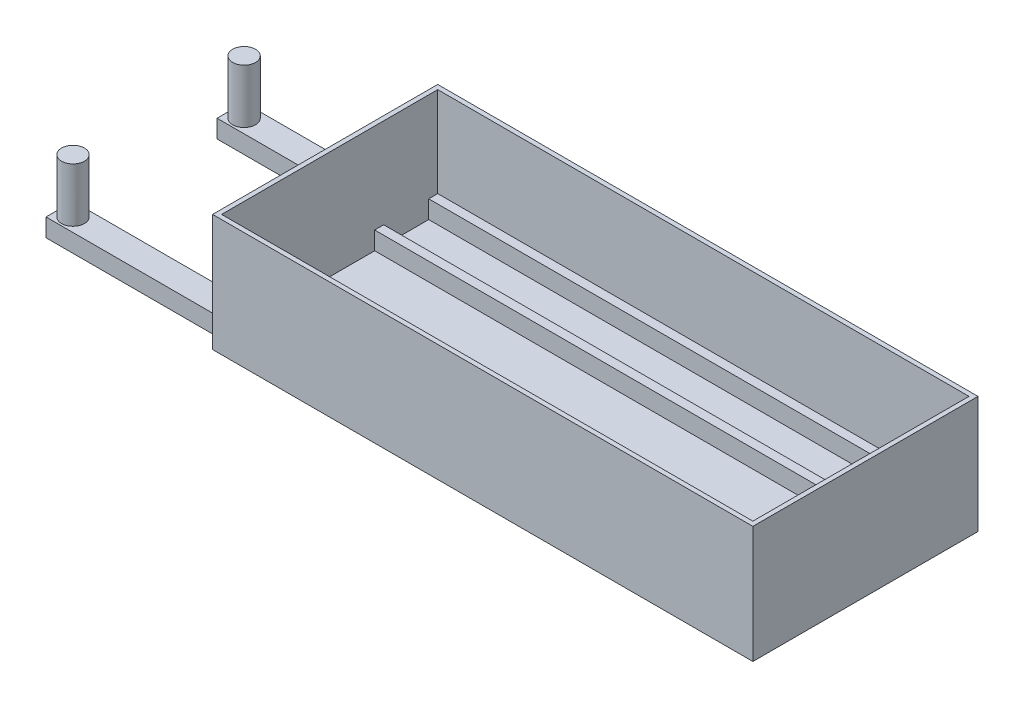
ISO-10303-21;
HEADER;
FILE_DESCRIPTION(('STEP AP214'),'2;1');
FILE_NAME('part.step','',(''),(''),'','','');
FILE_SCHEMA(('AUTOMOTIVE_DESIGN { 1 0 10303 214 1 1 1 1 }'));
ENDSEC;
DATA;
#1=APPLICATION_CONTEXT('core data for automotive mechanical design processes');
#2=APPLICATION_PROTOCOL_DEFINITION('international standard','automotive_design',2000,#1);
#3=PRODUCT_CONTEXT('',#1,'mechanical');
#4=PRODUCT('Part','Part','',(#3));
#5=PRODUCT_RELATED_PRODUCT_CATEGORY('part','',(#4));
#6=PRODUCT_DEFINITION_FORMATION('','',#4);
#7=PRODUCT_DEFINITION_CONTEXT('part definition',#1,'design');
#8=PRODUCT_DEFINITION('design','',#6,#7);
#9=PRODUCT_DEFINITION_SHAPE('','',#8);
#10=(LENGTH_UNIT() NAMED_UNIT(*) SI_UNIT(.MILLI.,.METRE.));
#11=(NAMED_UNIT(*) PLANE_ANGLE_UNIT() SI_UNIT($,.RADIAN.));
#12=(NAMED_UNIT(*) SI_UNIT($,.STERADIAN.) SOLID_ANGLE_UNIT());
#13=UNCERTAINTY_MEASURE_WITH_UNIT(LENGTH_MEASURE(1.E-05),#10,'distance_accuracy_value','');
#14=(GEOMETRIC_REPRESENTATION_CONTEXT(3) GLOBAL_UNCERTAINTY_ASSIGNED_CONTEXT((#13)) GLOBAL_UNIT_ASSIGNED_CONTEXT((#10,
#11,#12)) REPRESENTATION_CONTEXT('',''));
#15=CARTESIAN_POINT('',(0.,0.,0.));
#16=DIRECTION('',(0.,0.,1.));
#17=DIRECTION('',(1.,0.,0.));
#18=AXIS2_PLACEMENT_3D('',#15,#16,#17);
#19=CARTESIAN_POINT('',(-300.,130.,-125.));
#20=DIRECTION('',(1.,0.,0.));
#21=DIRECTION('',(0.,0.,-1.));
#22=AXIS2_PLACEMENT_3D('',#19,#20,#21);
#23=PLANE('',#22);
#24=DIRECTION('',(0.,-1.,0.));
#25=VECTOR('',#24,1.);
#26=CARTESIAN_POINT('',(-300.,0.,80.));
#27=LINE('',#26,#25);
#28=CARTESIAN_POINT('',(-300.,20.0533445197729,80.));
#29=VERTEX_POINT('',#28);
#30=CARTESIAN_POINT('',(-300.,0.,80.));
#31=VERTEX_POINT('',#30);
#32=EDGE_CURVE('E222',#29,#31,#27,.T.);
#33=ORIENTED_EDGE('',*,*,#32,.F.);
#34=DIRECTION('',(0.,0.,-1.));
#35=VECTOR('',#34,1.);
#36=CARTESIAN_POINT('',(-300.,20.0533445197728,0.));
#37=LINE('',#36,#35);
#38=CARTESIAN_POINT('',(-300.,20.0533445197728,110.));
#39=VERTEX_POINT('',#38);
#40=EDGE_CURVE('E227',#39,#29,#37,.T.);
#41=ORIENTED_EDGE('',*,*,#40,.F.);
#42=DIRECTION('',(0.,1.,0.));
#43=VECTOR('',#42,1.);
#44=CARTESIAN_POINT('',(-300.,0.,110.));
#45=LINE('',#44,#43);
#46=CARTESIAN_POINT('',(-300.,0.,110.));
#47=VERTEX_POINT('',#46);
#48=EDGE_CURVE('E410',#47,#39,#45,.T.);
#49=ORIENTED_EDGE('',*,*,#48,.F.);
#50=DIRECTION('',(0.,0.,1.));
#51=VECTOR('',#50,1.);
#52=CARTESIAN_POINT('',(-300.,0.,-125.));
#53=LINE('',#52,#51);
#54=CARTESIAN_POINT('',(-300.,0.,125.));
#55=VERTEX_POINT('',#54);
#56=EDGE_CURVE('E586',#47,#55,#53,.T.);
#57=ORIENTED_EDGE('',*,*,#56,.T.);
#58=DIRECTION('',(0.,-1.,0.));
#59=VECTOR('',#58,1.);
#60=CARTESIAN_POINT('',(-300.,130.,125.));
#61=LINE('',#60,#59);
#62=CARTESIAN_POINT('',(-300.,130.,125.));
#63=VERTEX_POINT('',#62);
#64=EDGE_CURVE('E577',#63,#55,#61,.T.);
#65=ORIENTED_EDGE('',*,*,#64,.F.);
#66=DIRECTION('',(0.,0.,1.));
#67=VECTOR('',#66,1.);
#68=CARTESIAN_POINT('',(-300.,130.,-125.));
#69=LINE('',#68,#67);
#70=CARTESIAN_POINT('',(-300.,130.,-125.));
#71=VERTEX_POINT('',#70);
#72=EDGE_CURVE('E575',#71,#63,#69,.T.);
#73=ORIENTED_EDGE('',*,*,#72,.F.);
#74=DIRECTION('',(0.,-1.,0.));
#75=VECTOR('',#74,1.);
#76=CARTESIAN_POINT('',(-300.,130.,-125.));
#77=LINE('',#76,#75);
#78=CARTESIAN_POINT('',(-300.,0.,-125.));
#79=VERTEX_POINT('',#78);
#80=EDGE_CURVE('E592',#71,#79,#77,.T.);
#81=ORIENTED_EDGE('',*,*,#80,.T.);
#82=CARTESIAN_POINT('',(-300.,0.,-110.));
#83=VERTEX_POINT('',#82);
#84=EDGE_CURVE('E569',#79,#83,#53,.T.);
#85=ORIENTED_EDGE('',*,*,#84,.T.);
#86=DIRECTION('',(0.,1.,0.));
#87=VECTOR('',#86,1.);
#88=CARTESIAN_POINT('',(-300.,0.,-110.));
#89=LINE('',#88,#87);
#90=CARTESIAN_POINT('',(-300.,20.,-110.));
#91=VERTEX_POINT('',#90);
#92=EDGE_CURVE('E426',#83,#91,#89,.T.);
#93=ORIENTED_EDGE('',*,*,#92,.T.);
#94=DIRECTION('',(0.,0.,1.));
#95=VECTOR('',#94,1.);
#96=CARTESIAN_POINT('',(-300.,20.,0.));
#97=LINE('',#96,#95);
#98=CARTESIAN_POINT('',(-300.,20.,-80.));
#99=VERTEX_POINT('',#98);
#100=EDGE_CURVE('E416',#91,#99,#97,.T.);
#101=ORIENTED_EDGE('',*,*,#100,.T.);
#102=DIRECTION('',(0.,-1.,0.));
#103=VECTOR('',#102,1.);
#104=CARTESIAN_POINT('',(-300.,0.,-80.));
#105=LINE('',#104,#103);
#106=CARTESIAN_POINT('',(-300.,0.,-80.));
#107=VERTEX_POINT('',#106);
#108=EDGE_CURVE('E413',#99,#107,#105,.T.);
#109=ORIENTED_EDGE('',*,*,#108,.T.);
#110=EDGE_CURVE('E589',#107,#31,#53,.T.);
#111=ORIENTED_EDGE('',*,*,#110,.T.);
#112=EDGE_LOOP('',(#33,#41,#49,#57,#65,#73,#81,#85,#93,#101,#109,#111));
#113=FACE_BOUND('',#112,.T.);
#114=ADVANCED_FACE('F207',(#113),#23,.F.);
#115=CARTESIAN_POINT('',(295.,10.,-120.));
#116=DIRECTION('',(1.,0.,0.));
#117=DIRECTION('',(0.,0.,-1.));
#118=AXIS2_PLACEMENT_3D('',#115,#116,#117);
#119=PLANE('',#118);
#120=DIRECTION('',(0.,-1.,0.));
#121=VECTOR('',#120,1.);
#122=CARTESIAN_POINT('',(295.,30.,-110.));
#123=LINE('',#122,#121);
#124=CARTESIAN_POINT('',(295.,30.,-110.));
#125=VERTEX_POINT('',#124);
#126=CARTESIAN_POINT('',(295.,10.,-110.));
#127=VERTEX_POINT('',#126);
#128=EDGE_CURVE('E449',#125,#127,#123,.T.);
#129=ORIENTED_EDGE('',*,*,#128,.T.);
#130=DIRECTION('',(0.,0.,-1.));
#131=VECTOR('',#130,1.);
#132=CARTESIAN_POINT('',(295.,10.,-120.));
#133=LINE('',#132,#131);
#134=CARTESIAN_POINT('',(295.,10.,-60.));
#135=VERTEX_POINT('',#134);
#136=EDGE_CURVE('E542',#135,#127,#133,.T.);
#137=ORIENTED_EDGE('',*,*,#136,.F.);
#138=DIRECTION('',(0.,-1.,0.));
#139=VECTOR('',#138,1.);
#140=CARTESIAN_POINT('',(295.,30.,-60.));
#141=LINE('',#140,#139);
#142=CARTESIAN_POINT('',(295.,30.,-60.));
#143=VERTEX_POINT('',#142);
#144=EDGE_CURVE('E470',#143,#135,#141,.T.);
#145=ORIENTED_EDGE('',*,*,#144,.F.);
#146=DIRECTION('',(0.,0.,-1.));
#147=VECTOR('',#146,1.);
#148=CARTESIAN_POINT('',(295.,30.,-50.));
#149=LINE('',#148,#147);
#150=CARTESIAN_POINT('',(295.,30.,-50.));
#151=VERTEX_POINT('',#150);
#152=EDGE_CURVE('E486',#151,#143,#149,.T.);
#153=ORIENTED_EDGE('',*,*,#152,.F.);
#154=DIRECTION('',(0.,-1.,0.));
#155=VECTOR('',#154,1.);
#156=CARTESIAN_POINT('',(295.,30.,-50.));
#157=LINE('',#156,#155);
#158=CARTESIAN_POINT('',(295.,10.,-50.));
#159=VERTEX_POINT('',#158);
#160=EDGE_CURVE('E468',#151,#159,#157,.T.);
#161=ORIENTED_EDGE('',*,*,#160,.T.);
#162=CARTESIAN_POINT('',(295.,10.,50.));
#163=VERTEX_POINT('',#162);
#164=EDGE_CURVE('E541',#163,#159,#133,.T.);
#165=ORIENTED_EDGE('',*,*,#164,.F.);
#166=DIRECTION('',(0.,-1.,0.));
#167=VECTOR('',#166,1.);
#168=CARTESIAN_POINT('',(295.,30.,50.));
#169=LINE('',#168,#167);
#170=CARTESIAN_POINT('',(295.,30.,50.));
#171=VERTEX_POINT('',#170);
#172=EDGE_CURVE('E496',#171,#163,#169,.T.);
#173=ORIENTED_EDGE('',*,*,#172,.F.);
#174=DIRECTION('',(0.,0.,-1.));
#175=VECTOR('',#174,1.);
#176=CARTESIAN_POINT('',(295.,30.,60.));
#177=LINE('',#176,#175);
#178=CARTESIAN_POINT('',(295.,30.,60.));
#179=VERTEX_POINT('',#178);
#180=EDGE_CURVE('E514',#179,#171,#177,.T.);
#181=ORIENTED_EDGE('',*,*,#180,.F.);
#182=DIRECTION('',(0.,-1.,0.));
#183=VECTOR('',#182,1.);
#184=CARTESIAN_POINT('',(295.,30.,60.));
#185=LINE('',#184,#183);
#186=CARTESIAN_POINT('',(295.,10.,60.));
#187=VERTEX_POINT('',#186);
#188=EDGE_CURVE('E483',#179,#187,#185,.T.);
#189=ORIENTED_EDGE('',*,*,#188,.T.);
#190=CARTESIAN_POINT('',(295.,10.,110.));
#191=VERTEX_POINT('',#190);
#192=EDGE_CURVE('E537',#191,#187,#133,.T.);
#193=ORIENTED_EDGE('',*,*,#192,.F.);
#194=DIRECTION('',(0.,-1.,0.));
#195=VECTOR('',#194,1.);
#196=CARTESIAN_POINT('',(295.,30.,110.));
#197=LINE('',#196,#195);
#198=CARTESIAN_POINT('',(295.,30.,110.));
#199=VERTEX_POINT('',#198);
#200=EDGE_CURVE('E529',#199,#191,#197,.T.);
#201=ORIENTED_EDGE('',*,*,#200,.F.);
#202=DIRECTION('',(0.,0.,-1.));
#203=VECTOR('',#202,1.);
#204=CARTESIAN_POINT('',(295.,30.,0.));
#205=LINE('',#204,#203);
#206=CARTESIAN_POINT('',(295.,30.,120.));
#207=VERTEX_POINT('',#206);
#208=EDGE_CURVE('E526',#207,#199,#205,.T.);
#209=ORIENTED_EDGE('',*,*,#208,.F.);
#210=DIRECTION('',(0.,1.,0.));
#211=VECTOR('',#210,1.);
#212=CARTESIAN_POINT('',(295.,10.,120.));
#213=LINE('',#212,#211);
#214=CARTESIAN_POINT('',(295.,130.,120.));
#215=VERTEX_POINT('',#214);
#216=EDGE_CURVE('E558',#207,#215,#213,.T.);
#217=ORIENTED_EDGE('',*,*,#216,.T.);
#218=DIRECTION('',(0.,0.,-1.));
#219=VECTOR('',#218,1.);
#220=CARTESIAN_POINT('',(295.,130.,-120.));
#221=LINE('',#220,#219);
#222=CARTESIAN_POINT('',(295.,130.,-120.));
#223=VERTEX_POINT('',#222);
#224=EDGE_CURVE('E536',#215,#223,#221,.T.);
#225=ORIENTED_EDGE('',*,*,#224,.T.);
#226=DIRECTION('',(0.,1.,0.));
#227=VECTOR('',#226,1.);
#228=CARTESIAN_POINT('',(295.,10.,-120.));
#229=LINE('',#228,#227);
#230=CARTESIAN_POINT('',(295.,30.,-120.));
#231=VERTEX_POINT('',#230);
#232=EDGE_CURVE('E545',#231,#223,#229,.T.);
#233=ORIENTED_EDGE('',*,*,#232,.F.);
#234=DIRECTION('',(0.,0.,1.));
#235=VECTOR('',#234,1.);
#236=CARTESIAN_POINT('',(295.,30.,-120.));
#237=LINE('',#236,#235);
#238=EDGE_CURVE('E459',#231,#125,#237,.T.);
#239=ORIENTED_EDGE('',*,*,#238,.T.);
#240=EDGE_LOOP('',(#129,#137,#145,#153,#161,#165,#173,#181,#189,#193,#201,#209,#217,#225,#233,#239));
#241=FACE_BOUND('',#240,.T.);
#242=ADVANCED_FACE('F638',(#241),#119,.F.);
#243=CARTESIAN_POINT('',(-295.,10.,-120.));
#244=DIRECTION('',(-1.,0.,0.));
#245=DIRECTION('',(0.,0.,1.));
#246=AXIS2_PLACEMENT_3D('',#243,#244,#245);
#247=PLANE('',#246);
#248=DIRECTION('',(0.,-1.,0.));
#249=VECTOR('',#248,1.);
#250=CARTESIAN_POINT('',(-295.,30.,-110.));
#251=LINE('',#250,#249);
#252=CARTESIAN_POINT('',(-295.,30.,-110.));
#253=VERTEX_POINT('',#252);
#254=CARTESIAN_POINT('',(-295.,10.,-110.));
#255=VERTEX_POINT('',#254);
#256=EDGE_CURVE('E447',#253,#255,#251,.T.);
#257=ORIENTED_EDGE('',*,*,#256,.F.);
#258=DIRECTION('',(0.,0.,1.));
#259=VECTOR('',#258,1.);
#260=CARTESIAN_POINT('',(-295.,30.,-120.));
#261=LINE('',#260,#259);
#262=CARTESIAN_POINT('',(-295.,30.,-120.));
#263=VERTEX_POINT('',#262);
#264=EDGE_CURVE('E456',#263,#253,#261,.T.);
#265=ORIENTED_EDGE('',*,*,#264,.F.);
#266=DIRECTION('',(0.,1.,0.));
#267=VECTOR('',#266,1.);
#268=CARTESIAN_POINT('',(-295.,10.,-120.));
#269=LINE('',#268,#267);
#270=CARTESIAN_POINT('',(-295.,130.,-120.));
#271=VERTEX_POINT('',#270);
#272=EDGE_CURVE('E563',#263,#271,#269,.T.);
#273=ORIENTED_EDGE('',*,*,#272,.T.);
#274=DIRECTION('',(0.,0.,1.));
#275=VECTOR('',#274,1.);
#276=CARTESIAN_POINT('',(-295.,130.,-120.));
#277=LINE('',#276,#275);
#278=CARTESIAN_POINT('',(-295.,130.,120.));
#279=VERTEX_POINT('',#278);
#280=EDGE_CURVE('E552',#271,#279,#277,.T.);
#281=ORIENTED_EDGE('',*,*,#280,.T.);
#282=DIRECTION('',(0.,1.,0.));
#283=VECTOR('',#282,1.);
#284=CARTESIAN_POINT('',(-295.,10.,120.));
#285=LINE('',#284,#283);
#286=CARTESIAN_POINT('',(-295.,30.,120.));
#287=VERTEX_POINT('',#286);
#288=EDGE_CURVE('E561',#287,#279,#285,.T.);
#289=ORIENTED_EDGE('',*,*,#288,.F.);
#290=DIRECTION('',(0.,0.,1.));
#291=VECTOR('',#290,1.);
#292=CARTESIAN_POINT('',(-295.,30.,0.));
#293=LINE('',#292,#291);
#294=CARTESIAN_POINT('',(-295.,30.,110.));
#295=VERTEX_POINT('',#294);
#296=EDGE_CURVE('E520',#295,#287,#293,.T.);
#297=ORIENTED_EDGE('',*,*,#296,.F.);
#298=DIRECTION('',(0.,-1.,0.));
#299=VECTOR('',#298,1.);
#300=CARTESIAN_POINT('',(-295.,30.,110.));
#301=LINE('',#300,#299);
#302=CARTESIAN_POINT('',(-295.,10.,110.));
#303=VERTEX_POINT('',#302);
#304=EDGE_CURVE('E533',#295,#303,#301,.T.);
#305=ORIENTED_EDGE('',*,*,#304,.T.);
#306=DIRECTION('',(0.,0.,1.));
#307=VECTOR('',#306,1.);
#308=CARTESIAN_POINT('',(-295.,10.,-120.));
#309=LINE('',#308,#307);
#310=CARTESIAN_POINT('',(-295.,10.,60.));
#311=VERTEX_POINT('',#310);
#312=EDGE_CURVE('E540',#311,#303,#309,.T.);
#313=ORIENTED_EDGE('',*,*,#312,.F.);
#314=DIRECTION('',(0.,-1.,0.));
#315=VECTOR('',#314,1.);
#316=CARTESIAN_POINT('',(-295.,30.,60.));
#317=LINE('',#316,#315);
#318=CARTESIAN_POINT('',(-295.,30.,60.));
#319=VERTEX_POINT('',#318);
#320=EDGE_CURVE('E501',#319,#311,#317,.T.);
#321=ORIENTED_EDGE('',*,*,#320,.F.);
#322=DIRECTION('',(0.,0.,1.));
#323=VECTOR('',#322,1.);
#324=CARTESIAN_POINT('',(-295.,30.,50.));
#325=LINE('',#324,#323);
#326=CARTESIAN_POINT('',(-295.,30.,50.));
#327=VERTEX_POINT('',#326);
#328=EDGE_CURVE('E503',#327,#319,#325,.T.);
#329=ORIENTED_EDGE('',*,*,#328,.F.);
#330=DIRECTION('',(0.,-1.,0.));
#331=VECTOR('',#330,1.);
#332=CARTESIAN_POINT('',(-295.,30.,50.));
#333=LINE('',#332,#331);
#334=CARTESIAN_POINT('',(-295.,10.,50.));
#335=VERTEX_POINT('',#334);
#336=EDGE_CURVE('E498',#327,#335,#333,.T.);
#337=ORIENTED_EDGE('',*,*,#336,.T.);
#338=CARTESIAN_POINT('',(-295.,10.,-50.));
#339=VERTEX_POINT('',#338);
#340=EDGE_CURVE('E546',#339,#335,#309,.T.);
#341=ORIENTED_EDGE('',*,*,#340,.F.);
#342=DIRECTION('',(0.,-1.,0.));
#343=VECTOR('',#342,1.);
#344=CARTESIAN_POINT('',(-295.,30.,-50.));
#345=LINE('',#344,#343);
#346=CARTESIAN_POINT('',(-295.,30.,-50.));
#347=VERTEX_POINT('',#346);
#348=EDGE_CURVE('E455',#347,#339,#345,.T.);
#349=ORIENTED_EDGE('',*,*,#348,.F.);
#350=DIRECTION('',(0.,0.,1.));
#351=VECTOR('',#350,1.);
#352=CARTESIAN_POINT('',(-295.,30.,-60.));
#353=LINE('',#352,#351);
#354=CARTESIAN_POINT('',(-295.,30.,-60.));
#355=VERTEX_POINT('',#354);
#356=EDGE_CURVE('E480',#355,#347,#353,.T.);
#357=ORIENTED_EDGE('',*,*,#356,.F.);
#358=DIRECTION('',(0.,-1.,0.));
#359=VECTOR('',#358,1.);
#360=CARTESIAN_POINT('',(-295.,30.,-60.));
#361=LINE('',#360,#359);
#362=CARTESIAN_POINT('',(-295.,10.,-60.));
#363=VERTEX_POINT('',#362);
#364=EDGE_CURVE('E473',#355,#363,#361,.T.);
#365=ORIENTED_EDGE('',*,*,#364,.T.);
#366=EDGE_CURVE('E543',#255,#363,#309,.T.);
#367=ORIENTED_EDGE('',*,*,#366,.F.);
#368=EDGE_LOOP('',(#257,#265,#273,#281,#289,#297,#305,#313,#321,#329,#337,#341,#349,#357,#365,#367));
#369=FACE_BOUND('',#368,.T.);
#370=ADVANCED_FACE('F645',(#369),#247,.F.);
#371=CARTESIAN_POINT('',(0.,10.,0.));
#372=DIRECTION('',(0.,1.,0.));
#373=DIRECTION('',(0.,0.,1.));
#374=AXIS2_PLACEMENT_3D('',#371,#372,#373);
#375=PLANE('',#374);
#376=ORIENTED_EDGE('',*,*,#136,.T.);
#377=DIRECTION('',(1.,0.,0.));
#378=VECTOR('',#377,1.);
#379=CARTESIAN_POINT('',(-295.,10.,-110.));
#380=LINE('',#379,#378);
#381=EDGE_CURVE('E453',#255,#127,#380,.T.);
#382=ORIENTED_EDGE('',*,*,#381,.F.);
#383=ORIENTED_EDGE('',*,*,#366,.T.);
#384=DIRECTION('',(1.,0.,0.));
#385=VECTOR('',#384,1.);
#386=CARTESIAN_POINT('',(-295.,10.,-60.));
#387=LINE('',#386,#385);
#388=EDGE_CURVE('E477',#363,#135,#387,.T.);
#389=ORIENTED_EDGE('',*,*,#388,.T.);
#390=EDGE_LOOP('',(#376,#382,#383,#389));
#391=FACE_BOUND('',#390,.T.);
#392=ADVANCED_FACE('F663',(#391),#375,.T.);
#393=ORIENTED_EDGE('',*,*,#164,.T.);
#394=DIRECTION('',(1.,0.,0.));
#395=VECTOR('',#394,1.);
#396=CARTESIAN_POINT('',(-295.,10.,-50.));
#397=LINE('',#396,#395);
#398=EDGE_CURVE('E479',#339,#159,#397,.T.);
#399=ORIENTED_EDGE('',*,*,#398,.F.);
#400=ORIENTED_EDGE('',*,*,#340,.T.);
#401=DIRECTION('',(-1.,0.,0.));
#402=VECTOR('',#401,1.);
#403=CARTESIAN_POINT('',(295.,10.,50.));
#404=LINE('',#403,#402);
#405=EDGE_CURVE('E504',#163,#335,#404,.T.);
#406=ORIENTED_EDGE('',*,*,#405,.F.);
#407=EDGE_LOOP('',(#393,#399,#400,#406));
#408=FACE_BOUND('',#407,.T.);
#409=ADVANCED_FACE('F660',(#408),#375,.T.);
#410=ORIENTED_EDGE('',*,*,#192,.T.);
#411=DIRECTION('',(1.,0.,0.));
#412=VECTOR('',#411,1.);
#413=CARTESIAN_POINT('',(-295.,10.,60.));
#414=LINE('',#413,#412);
#415=EDGE_CURVE('E507',#311,#187,#414,.T.);
#416=ORIENTED_EDGE('',*,*,#415,.F.);
#417=ORIENTED_EDGE('',*,*,#312,.T.);
#418=DIRECTION('',(1.,0.,0.));
#419=VECTOR('',#418,1.);
#420=CARTESIAN_POINT('',(0.,10.,110.));
#421=LINE('',#420,#419);
#422=EDGE_CURVE('E510',#303,#191,#421,.T.);
#423=ORIENTED_EDGE('',*,*,#422,.T.);
#424=EDGE_LOOP('',(#410,#416,#417,#423));
#425=FACE_BOUND('',#424,.T.);
#426=ADVANCED_FACE('F656',(#425),#375,.T.);
#427=CARTESIAN_POINT('',(-300.,130.,125.));
#428=DIRECTION('',(0.,0.,-1.));
#429=DIRECTION('',(-1.,0.,0.));
#430=AXIS2_PLACEMENT_3D('',#427,#428,#429);
#431=PLANE('',#430);
#432=DIRECTION('',(1.,0.,0.));
#433=VECTOR('',#432,1.);
#434=CARTESIAN_POINT('',(-300.,0.,125.));
#435=LINE('',#434,#433);
#436=CARTESIAN_POINT('',(300.,0.,125.));
#437=VERTEX_POINT('',#436);
#438=EDGE_CURVE('E560',#55,#437,#435,.T.);
#439=ORIENTED_EDGE('',*,*,#438,.T.);
#440=DIRECTION('',(0.,-1.,0.));
#441=VECTOR('',#440,1.);
#442=CARTESIAN_POINT('',(300.,130.,125.));
#443=LINE('',#442,#441);
#444=CARTESIAN_POINT('',(300.,130.,125.));
#445=VERTEX_POINT('',#444);
#446=EDGE_CURVE('E215',#445,#437,#443,.T.);
#447=ORIENTED_EDGE('',*,*,#446,.F.);
#448=DIRECTION('',(1.,0.,0.));
#449=VECTOR('',#448,1.);
#450=CARTESIAN_POINT('',(-300.,130.,125.));
#451=LINE('',#450,#449);
#452=EDGE_CURVE('E566',#63,#445,#451,.T.);
#453=ORIENTED_EDGE('',*,*,#452,.F.);
#454=ORIENTED_EDGE('',*,*,#64,.T.);
#455=EDGE_LOOP('',(#439,#447,#453,#454));
#456=FACE_BOUND('',#455,.T.);
#457=ADVANCED_FACE('F209',(#456),#431,.F.);
#458=CARTESIAN_POINT('',(300.,130.,-125.));
#459=DIRECTION('',(1.,0.,0.));
#460=DIRECTION('',(0.,0.,-1.));
#461=AXIS2_PLACEMENT_3D('',#458,#459,#460);
#462=PLANE('',#461);
#463=DIRECTION('',(0.,0.,1.));
#464=VECTOR('',#463,1.);
#465=CARTESIAN_POINT('',(300.,0.,-125.));
#466=LINE('',#465,#464);
#467=CARTESIAN_POINT('',(300.,0.,-125.));
#468=VERTEX_POINT('',#467);
#469=EDGE_CURVE('E580',#468,#437,#466,.T.);
#470=ORIENTED_EDGE('',*,*,#469,.F.);
#471=DIRECTION('',(0.,-1.,0.));
#472=VECTOR('',#471,1.);
#473=CARTESIAN_POINT('',(300.,130.,-125.));
#474=LINE('',#473,#472);
#475=CARTESIAN_POINT('',(300.,130.,-125.));
#476=VERTEX_POINT('',#475);
#477=EDGE_CURVE('E594',#476,#468,#474,.T.);
#478=ORIENTED_EDGE('',*,*,#477,.F.);
#479=DIRECTION('',(0.,0.,1.));
#480=VECTOR('',#479,1.);
#481=CARTESIAN_POINT('',(300.,130.,-125.));
#482=LINE('',#481,#480);
#483=EDGE_CURVE('E568',#476,#445,#482,.T.);
#484=ORIENTED_EDGE('',*,*,#483,.T.);
#485=ORIENTED_EDGE('',*,*,#446,.T.);
#486=EDGE_LOOP('',(#470,#478,#484,#485));
#487=FACE_BOUND('',#486,.T.);
#488=ADVANCED_FACE('F598',(#487),#462,.T.);
#489=CARTESIAN_POINT('',(-300.,130.,-125.));
#490=DIRECTION('',(0.,0.,-1.));
#491=DIRECTION('',(-1.,0.,0.));
#492=AXIS2_PLACEMENT_3D('',#489,#490,#491);
#493=PLANE('',#492);
#494=DIRECTION('',(1.,0.,0.));
#495=VECTOR('',#494,1.);
#496=CARTESIAN_POINT('',(-300.,0.,-125.));
#497=LINE('',#496,#495);
#498=EDGE_CURVE('E583',#79,#468,#497,.T.);
#499=ORIENTED_EDGE('',*,*,#498,.F.);
#500=ORIENTED_EDGE('',*,*,#80,.F.);
#501=DIRECTION('',(1.,0.,0.));
#502=VECTOR('',#501,1.);
#503=CARTESIAN_POINT('',(-300.,130.,-125.));
#504=LINE('',#503,#502);
#505=EDGE_CURVE('E572',#71,#476,#504,.T.);
#506=ORIENTED_EDGE('',*,*,#505,.T.);
#507=ORIENTED_EDGE('',*,*,#477,.T.);
#508=EDGE_LOOP('',(#499,#500,#506,#507));
#509=FACE_BOUND('',#508,.T.);
#510=ADVANCED_FACE('F609',(#509),#493,.T.);
#511=CARTESIAN_POINT('',(0.,130.,0.));
#512=DIRECTION('',(0.,-1.,0.));
#513=DIRECTION('',(0.,0.,-1.));
#514=AXIS2_PLACEMENT_3D('',#511,#512,#513);
#515=PLANE('',#514);
#516=DIRECTION('',(-1.,0.,0.));
#517=VECTOR('',#516,1.);
#518=CARTESIAN_POINT('',(-295.,130.,-120.));
#519=LINE('',#518,#517);
#520=EDGE_CURVE('E549',#223,#271,#519,.T.);
#521=ORIENTED_EDGE('',*,*,#520,.F.);
#522=ORIENTED_EDGE('',*,*,#224,.F.);
#523=DIRECTION('',(1.,0.,0.));
#524=VECTOR('',#523,1.);
#525=CARTESIAN_POINT('',(-295.,130.,120.));
#526=LINE('',#525,#524);
#527=EDGE_CURVE('E555',#279,#215,#526,.T.);
#528=ORIENTED_EDGE('',*,*,#527,.F.);
#529=ORIENTED_EDGE('',*,*,#280,.F.);
#530=EDGE_LOOP('',(#521,#522,#528,#529));
#531=FACE_BOUND('',#530,.T.);
#532=ORIENTED_EDGE('',*,*,#452,.T.);
#533=ORIENTED_EDGE('',*,*,#483,.F.);
#534=ORIENTED_EDGE('',*,*,#505,.F.);
#535=ORIENTED_EDGE('',*,*,#72,.T.);
#536=EDGE_LOOP('',(#532,#533,#534,#535));
#537=FACE_BOUND('',#536,.T.);
#538=ADVANCED_FACE('F613',(#531,#537),#515,.F.);
#539=CARTESIAN_POINT('',(0.,0.,0.));
#540=DIRECTION('',(0.,-1.,0.));
#541=DIRECTION('',(0.,0.,-1.));
#542=AXIS2_PLACEMENT_3D('',#539,#540,#541);
#543=PLANE('',#542);
#544=ORIENTED_EDGE('',*,*,#438,.F.);
#545=ORIENTED_EDGE('',*,*,#56,.F.);
#546=DIRECTION('',(1.,0.,0.));
#547=VECTOR('',#546,1.);
#548=CARTESIAN_POINT('',(-500.,0.,110.));
#549=LINE('',#548,#547);
#550=CARTESIAN_POINT('',(-500.,0.,110.));
#551=VERTEX_POINT('',#550);
#552=EDGE_CURVE('E418',#551,#47,#549,.T.);
#553=ORIENTED_EDGE('',*,*,#552,.F.);
#554=DIRECTION('',(0.,0.,1.));
#555=VECTOR('',#554,1.);
#556=CARTESIAN_POINT('',(-500.,0.,0.));
#557=LINE('',#556,#555);
#558=CARTESIAN_POINT('',(-500.,0.,80.));
#559=VERTEX_POINT('',#558);
#560=EDGE_CURVE('E400',#559,#551,#557,.T.);
#561=ORIENTED_EDGE('',*,*,#560,.F.);
#562=DIRECTION('',(1.,0.,0.));
#563=VECTOR('',#562,1.);
#564=CARTESIAN_POINT('',(-500.,0.,80.));
#565=LINE('',#564,#563);
#566=EDGE_CURVE('E397',#559,#31,#565,.T.);
#567=ORIENTED_EDGE('',*,*,#566,.T.);
#568=ORIENTED_EDGE('',*,*,#110,.F.);
#569=DIRECTION('',(1.,0.,0.));
#570=VECTOR('',#569,1.);
#571=CARTESIAN_POINT('',(-500.,0.,-80.));
#572=LINE('',#571,#570);
#573=CARTESIAN_POINT('',(-500.,0.,-80.));
#574=VERTEX_POINT('',#573);
#575=EDGE_CURVE('E433',#574,#107,#572,.T.);
#576=ORIENTED_EDGE('',*,*,#575,.F.);
#577=DIRECTION('',(0.,0.,1.));
#578=VECTOR('',#577,1.);
#579=CARTESIAN_POINT('',(-500.,0.,0.));
#580=LINE('',#579,#578);
#581=CARTESIAN_POINT('',(-500.,0.,-110.));
#582=VERTEX_POINT('',#581);
#583=EDGE_CURVE('E432',#582,#574,#580,.T.);
#584=ORIENTED_EDGE('',*,*,#583,.F.);
#585=DIRECTION('',(1.,0.,0.));
#586=VECTOR('',#585,1.);
#587=CARTESIAN_POINT('',(-500.,0.,-110.));
#588=LINE('',#587,#586);
#589=EDGE_CURVE('E440',#582,#83,#588,.T.);
#590=ORIENTED_EDGE('',*,*,#589,.T.);
#591=ORIENTED_EDGE('',*,*,#84,.F.);
#592=ORIENTED_EDGE('',*,*,#498,.T.);
#593=ORIENTED_EDGE('',*,*,#469,.T.);
#594=EDGE_LOOP('',(#544,#545,#553,#561,#567,#568,#576,#584,#590,#591,#592,#593));
#595=FACE_BOUND('',#594,.T.);
#596=ADVANCED_FACE('F605',(#595),#543,.T.);
#597=CARTESIAN_POINT('',(-295.,10.,120.));
#598=DIRECTION('',(0.,0.,1.));
#599=DIRECTION('',(1.,0.,0.));
#600=AXIS2_PLACEMENT_3D('',#597,#598,#599);
#601=PLANE('',#600);
#602=ORIENTED_EDGE('',*,*,#216,.F.);
#603=DIRECTION('',(1.,0.,0.));
#604=VECTOR('',#603,1.);
#605=CARTESIAN_POINT('',(0.,30.,120.));
#606=LINE('',#605,#604);
#607=EDGE_CURVE('E523',#287,#207,#606,.T.);
#608=ORIENTED_EDGE('',*,*,#607,.F.);
#609=ORIENTED_EDGE('',*,*,#288,.T.);
#610=ORIENTED_EDGE('',*,*,#527,.T.);
#611=EDGE_LOOP('',(#602,#608,#609,#610));
#612=FACE_BOUND('',#611,.T.);
#613=ADVANCED_FACE('F709',(#612),#601,.F.);
#614=CARTESIAN_POINT('',(-295.,10.,-120.));
#615=DIRECTION('',(0.,0.,-1.));
#616=DIRECTION('',(-1.,0.,0.));
#617=AXIS2_PLACEMENT_3D('',#614,#615,#616);
#618=PLANE('',#617);
#619=ORIENTED_EDGE('',*,*,#272,.F.);
#620=DIRECTION('',(1.,0.,0.));
#621=VECTOR('',#620,1.);
#622=CARTESIAN_POINT('',(-295.,30.,-120.));
#623=LINE('',#622,#621);
#624=EDGE_CURVE('E452',#263,#231,#623,.T.);
#625=ORIENTED_EDGE('',*,*,#624,.T.);
#626=ORIENTED_EDGE('',*,*,#232,.T.);
#627=ORIENTED_EDGE('',*,*,#520,.T.);
#628=EDGE_LOOP('',(#619,#625,#626,#627));
#629=FACE_BOUND('',#628,.T.);
#630=ADVANCED_FACE('F719',(#629),#618,.F.);
#631=CARTESIAN_POINT('',(0.,30.,110.));
#632=DIRECTION('',(0.,0.,-1.));
#633=DIRECTION('',(-1.,0.,0.));
#634=AXIS2_PLACEMENT_3D('',#631,#632,#633);
#635=PLANE('',#634);
#636=ORIENTED_EDGE('',*,*,#422,.F.);
#637=ORIENTED_EDGE('',*,*,#304,.F.);
#638=DIRECTION('',(1.,0.,0.));
#639=VECTOR('',#638,1.);
#640=CARTESIAN_POINT('',(0.,30.,110.));
#641=LINE('',#640,#639);
#642=EDGE_CURVE('E517',#295,#199,#641,.T.);
#643=ORIENTED_EDGE('',*,*,#642,.T.);
#644=ORIENTED_EDGE('',*,*,#200,.T.);
#645=EDGE_LOOP('',(#636,#637,#643,#644));
#646=FACE_BOUND('',#645,.T.);
#647=ADVANCED_FACE('F704',(#646),#635,.T.);
#648=CARTESIAN_POINT('',(0.,30.,0.));
#649=DIRECTION('',(0.,1.,0.));
#650=DIRECTION('',(0.,0.,1.));
#651=AXIS2_PLACEMENT_3D('',#648,#649,#650);
#652=PLANE('',#651);
#653=ORIENTED_EDGE('',*,*,#642,.F.);
#654=ORIENTED_EDGE('',*,*,#296,.T.);
#655=ORIENTED_EDGE('',*,*,#607,.T.);
#656=ORIENTED_EDGE('',*,*,#208,.T.);
#657=EDGE_LOOP('',(#653,#654,#655,#656));
#658=FACE_BOUND('',#657,.T.);
#659=ADVANCED_FACE('F707',(#658),#652,.T.);
#660=CARTESIAN_POINT('',(-295.,30.,60.));
#661=DIRECTION('',(0.,0.,-1.));
#662=DIRECTION('',(-1.,0.,0.));
#663=AXIS2_PLACEMENT_3D('',#660,#661,#662);
#664=PLANE('',#663);
#665=ORIENTED_EDGE('',*,*,#415,.T.);
#666=ORIENTED_EDGE('',*,*,#188,.F.);
#667=DIRECTION('',(1.,0.,0.));
#668=VECTOR('',#667,1.);
#669=CARTESIAN_POINT('',(-295.,30.,60.));
#670=LINE('',#669,#668);
#671=EDGE_CURVE('E508',#319,#179,#670,.T.);
#672=ORIENTED_EDGE('',*,*,#671,.F.);
#673=ORIENTED_EDGE('',*,*,#320,.T.);
#674=EDGE_LOOP('',(#665,#666,#672,#673));
#675=FACE_BOUND('',#674,.T.);
#676=ADVANCED_FACE('F746',(#675),#664,.F.);
#677=CARTESIAN_POINT('',(295.,30.,50.));
#678=DIRECTION('',(0.,0.,1.));
#679=DIRECTION('',(1.,0.,0.));
#680=AXIS2_PLACEMENT_3D('',#677,#678,#679);
#681=PLANE('',#680);
#682=ORIENTED_EDGE('',*,*,#405,.T.);
#683=ORIENTED_EDGE('',*,*,#336,.F.);
#684=DIRECTION('',(-1.,0.,0.));
#685=VECTOR('',#684,1.);
#686=CARTESIAN_POINT('',(295.,30.,50.));
#687=LINE('',#686,#685);
#688=EDGE_CURVE('E512',#171,#327,#687,.T.);
#689=ORIENTED_EDGE('',*,*,#688,.F.);
#690=ORIENTED_EDGE('',*,*,#172,.T.);
#691=EDGE_LOOP('',(#682,#683,#689,#690));
#692=FACE_BOUND('',#691,.T.);
#693=ADVANCED_FACE('F749',(#692),#681,.F.);
#694=CARTESIAN_POINT('',(0.,30.,0.));
#695=DIRECTION('',(0.,1.,0.));
#696=DIRECTION('',(0.,0.,1.));
#697=AXIS2_PLACEMENT_3D('',#694,#695,#696);
#698=PLANE('',#697);
#699=ORIENTED_EDGE('',*,*,#671,.T.);
#700=ORIENTED_EDGE('',*,*,#180,.T.);
#701=ORIENTED_EDGE('',*,*,#688,.T.);
#702=ORIENTED_EDGE('',*,*,#328,.T.);
#703=EDGE_LOOP('',(#699,#700,#701,#702));
#704=FACE_BOUND('',#703,.T.);
#705=ADVANCED_FACE('F742',(#704),#698,.T.);
#706=CARTESIAN_POINT('',(-295.,30.,-50.));
#707=DIRECTION('',(0.,0.,-1.));
#708=DIRECTION('',(-1.,0.,0.));
#709=AXIS2_PLACEMENT_3D('',#706,#707,#708);
#710=PLANE('',#709);
#711=ORIENTED_EDGE('',*,*,#398,.T.);
#712=ORIENTED_EDGE('',*,*,#160,.F.);
#713=DIRECTION('',(1.,0.,0.));
#714=VECTOR('',#713,1.);
#715=CARTESIAN_POINT('',(-295.,30.,-50.));
#716=LINE('',#715,#714);
#717=EDGE_CURVE('E489',#347,#151,#716,.T.);
#718=ORIENTED_EDGE('',*,*,#717,.F.);
#719=ORIENTED_EDGE('',*,*,#348,.T.);
#720=EDGE_LOOP('',(#711,#712,#718,#719));
#721=FACE_BOUND('',#720,.T.);
#722=ADVANCED_FACE('F689',(#721),#710,.F.);
#723=CARTESIAN_POINT('',(-295.,30.,-60.));
#724=DIRECTION('',(0.,0.,-1.));
#725=DIRECTION('',(-1.,0.,0.));
#726=AXIS2_PLACEMENT_3D('',#723,#724,#725);
#727=PLANE('',#726);
#728=ORIENTED_EDGE('',*,*,#388,.F.);
#729=ORIENTED_EDGE('',*,*,#364,.F.);
#730=DIRECTION('',(1.,0.,0.));
#731=VECTOR('',#730,1.);
#732=CARTESIAN_POINT('',(-295.,30.,-60.));
#733=LINE('',#732,#731);
#734=EDGE_CURVE('E476',#355,#143,#733,.T.);
#735=ORIENTED_EDGE('',*,*,#734,.T.);
#736=ORIENTED_EDGE('',*,*,#144,.T.);
#737=EDGE_LOOP('',(#728,#729,#735,#736));
#738=FACE_BOUND('',#737,.T.);
#739=ADVANCED_FACE('F734',(#738),#727,.T.);
#740=CARTESIAN_POINT('',(0.,30.,0.));
#741=DIRECTION('',(0.,1.,0.));
#742=DIRECTION('',(0.,0.,1.));
#743=AXIS2_PLACEMENT_3D('',#740,#741,#742);
#744=PLANE('',#743);
#745=ORIENTED_EDGE('',*,*,#356,.T.);
#746=ORIENTED_EDGE('',*,*,#717,.T.);
#747=ORIENTED_EDGE('',*,*,#152,.T.);
#748=ORIENTED_EDGE('',*,*,#734,.F.);
#749=EDGE_LOOP('',(#745,#746,#747,#748));
#750=FACE_BOUND('',#749,.T.);
#751=ADVANCED_FACE('F726',(#750),#744,.T.);
#752=CARTESIAN_POINT('',(-295.,30.,-110.));
#753=DIRECTION('',(0.,0.,-1.));
#754=DIRECTION('',(-1.,0.,0.));
#755=AXIS2_PLACEMENT_3D('',#752,#753,#754);
#756=PLANE('',#755);
#757=ORIENTED_EDGE('',*,*,#381,.T.);
#758=ORIENTED_EDGE('',*,*,#128,.F.);
#759=DIRECTION('',(1.,0.,0.));
#760=VECTOR('',#759,1.);
#761=CARTESIAN_POINT('',(-295.,30.,-110.));
#762=LINE('',#761,#760);
#763=EDGE_CURVE('E462',#253,#125,#762,.T.);
#764=ORIENTED_EDGE('',*,*,#763,.F.);
#765=ORIENTED_EDGE('',*,*,#256,.T.);
#766=EDGE_LOOP('',(#757,#758,#764,#765));
#767=FACE_BOUND('',#766,.T.);
#768=ADVANCED_FACE('F723',(#767),#756,.F.);
#769=CARTESIAN_POINT('',(0.,30.,0.));
#770=DIRECTION('',(0.,1.,0.));
#771=DIRECTION('',(0.,0.,1.));
#772=AXIS2_PLACEMENT_3D('',#769,#770,#771);
#773=PLANE('',#772);
#774=ORIENTED_EDGE('',*,*,#264,.T.);
#775=ORIENTED_EDGE('',*,*,#763,.T.);
#776=ORIENTED_EDGE('',*,*,#238,.F.);
#777=ORIENTED_EDGE('',*,*,#624,.F.);
#778=EDGE_LOOP('',(#774,#775,#776,#777));
#779=FACE_BOUND('',#778,.T.);
#780=ADVANCED_FACE('F721',(#779),#773,.T.);
#781=CARTESIAN_POINT('',(-500.,0.,-80.));
#782=DIRECTION('',(0.,0.,1.));
#783=DIRECTION('',(1.,0.,0.));
#784=AXIS2_PLACEMENT_3D('',#781,#782,#783);
#785=PLANE('',#784);
#786=ORIENTED_EDGE('',*,*,#108,.F.);
#787=DIRECTION('',(1.,0.,0.));
#788=VECTOR('',#787,1.);
#789=CARTESIAN_POINT('',(-500.,20.,-80.));
#790=LINE('',#789,#788);
#791=CARTESIAN_POINT('',(-500.,20.,-80.));
#792=VERTEX_POINT('',#791);
#793=EDGE_CURVE('E444',#792,#99,#790,.T.);
#794=ORIENTED_EDGE('',*,*,#793,.F.);
#795=DIRECTION('',(0.,-1.,0.));
#796=VECTOR('',#795,1.);
#797=CARTESIAN_POINT('',(-500.,0.,-80.));
#798=LINE('',#797,#796);
#799=EDGE_CURVE('E422',#792,#574,#798,.T.);
#800=ORIENTED_EDGE('',*,*,#799,.T.);
#801=ORIENTED_EDGE('',*,*,#575,.T.);
#802=EDGE_LOOP('',(#786,#794,#800,#801));
#803=FACE_BOUND('',#802,.T.);
#804=ADVANCED_FACE('F732',(#803),#785,.T.);
#805=CARTESIAN_POINT('',(-500.,20.,0.));
#806=DIRECTION('',(0.,1.,0.));
#807=DIRECTION('',(0.,0.,1.));
#808=AXIS2_PLACEMENT_3D('',#805,#806,#807);
#809=PLANE('',#808);
#810=CARTESIAN_POINT('',(-485.,20.,-95.));
#811=DIRECTION('',(0.,1.,0.));
#812=DIRECTION('',(0.,0.,1.));
#813=AXIS2_PLACEMENT_3D('',#810,#811,#812);
#814=CIRCLE('',#813,12.7);
#815=CARTESIAN_POINT('',(-485.,20.,-82.3));
#816=VERTEX_POINT('',#815);
#817=EDGE_CURVE('E869',#816,#816,#814,.T.);
#818=ORIENTED_EDGE('',*,*,#817,.F.);
#819=EDGE_LOOP('',(#818));
#820=FACE_BOUND('',#819,.T.);
#821=ORIENTED_EDGE('',*,*,#100,.F.);
#822=DIRECTION('',(1.,0.,0.));
#823=VECTOR('',#822,1.);
#824=CARTESIAN_POINT('',(-500.,20.,-110.));
#825=LINE('',#824,#823);
#826=CARTESIAN_POINT('',(-500.,20.,-110.));
#827=VERTEX_POINT('',#826);
#828=EDGE_CURVE('E442',#827,#91,#825,.T.);
#829=ORIENTED_EDGE('',*,*,#828,.F.);
#830=DIRECTION('',(0.,0.,1.));
#831=VECTOR('',#830,1.);
#832=CARTESIAN_POINT('',(-500.,20.,0.));
#833=LINE('',#832,#831);
#834=EDGE_CURVE('E425',#827,#792,#833,.T.);
#835=ORIENTED_EDGE('',*,*,#834,.T.);
#836=ORIENTED_EDGE('',*,*,#793,.T.);
#837=EDGE_LOOP('',(#821,#829,#835,#836));
#838=FACE_BOUND('',#837,.T.);
#839=ADVANCED_FACE('F779',(#820,#838),#809,.T.);
#840=CARTESIAN_POINT('',(-500.,0.,-110.));
#841=DIRECTION('',(0.,0.,-1.));
#842=DIRECTION('',(-1.,0.,0.));
#843=AXIS2_PLACEMENT_3D('',#840,#841,#842);
#844=PLANE('',#843);
#845=ORIENTED_EDGE('',*,*,#92,.F.);
#846=ORIENTED_EDGE('',*,*,#589,.F.);
#847=DIRECTION('',(0.,1.,0.));
#848=VECTOR('',#847,1.);
#849=CARTESIAN_POINT('',(-500.,0.,-110.));
#850=LINE('',#849,#848);
#851=EDGE_CURVE('E429',#582,#827,#850,.T.);
#852=ORIENTED_EDGE('',*,*,#851,.T.);
#853=ORIENTED_EDGE('',*,*,#828,.T.);
#854=EDGE_LOOP('',(#845,#846,#852,#853));
#855=FACE_BOUND('',#854,.T.);
#856=ADVANCED_FACE('F787',(#855),#844,.T.);
#857=CARTESIAN_POINT('',(-500.,0.,0.));
#858=DIRECTION('',(-1.,0.,0.));
#859=DIRECTION('',(0.,0.,1.));
#860=AXIS2_PLACEMENT_3D('',#857,#858,#859);
#861=PLANE('',#860);
#862=ORIENTED_EDGE('',*,*,#799,.F.);
#863=ORIENTED_EDGE('',*,*,#834,.F.);
#864=ORIENTED_EDGE('',*,*,#851,.F.);
#865=ORIENTED_EDGE('',*,*,#583,.T.);
#866=EDGE_LOOP('',(#862,#863,#864,#865));
#867=FACE_BOUND('',#866,.T.);
#868=ADVANCED_FACE('F795',(#867),#861,.T.);
#869=CARTESIAN_POINT('',(-500.,20.0533445197728,0.));
#870=DIRECTION('',(0.,-1.,0.));
#871=DIRECTION('',(0.,0.,-1.));
#872=AXIS2_PLACEMENT_3D('',#869,#870,#871);
#873=PLANE('',#872);
#874=CARTESIAN_POINT('',(-485.,20.0533445197728,95.));
#875=DIRECTION('',(0.,-1.,0.));
#876=DIRECTION('',(0.,0.,-1.));
#877=AXIS2_PLACEMENT_3D('',#874,#875,#876);
#878=CIRCLE('',#877,12.7);
#879=CARTESIAN_POINT('',(-485.,20.0533445197728,82.3));
#880=VERTEX_POINT('',#879);
#881=EDGE_CURVE('E12',#880,#880,#878,.F.);
#882=ORIENTED_EDGE('',*,*,#881,.F.);
#883=EDGE_LOOP('',(#882));
#884=FACE_BOUND('',#883,.T.);
#885=ORIENTED_EDGE('',*,*,#40,.T.);
#886=DIRECTION('',(1.,0.,0.));
#887=VECTOR('',#886,1.);
#888=CARTESIAN_POINT('',(-500.,20.0533445197728,80.0000000000001));
#889=LINE('',#888,#887);
#890=CARTESIAN_POINT('',(-500.,20.0533445197728,80.0000000000001));
#891=VERTEX_POINT('',#890);
#892=EDGE_CURVE('E395',#891,#29,#889,.T.);
#893=ORIENTED_EDGE('',*,*,#892,.F.);
#894=DIRECTION('',(0.,0.,-1.));
#895=VECTOR('',#894,1.);
#896=CARTESIAN_POINT('',(-500.,20.0533445197728,0.));
#897=LINE('',#896,#895);
#898=CARTESIAN_POINT('',(-500.,20.0533445197729,110.));
#899=VERTEX_POINT('',#898);
#900=EDGE_CURVE('E401',#899,#891,#897,.T.);
#901=ORIENTED_EDGE('',*,*,#900,.F.);
#902=DIRECTION('',(1.,0.,0.));
#903=VECTOR('',#902,1.);
#904=CARTESIAN_POINT('',(-500.,20.0533445197729,110.));
#905=LINE('',#904,#903);
#906=EDGE_CURVE('E620',#899,#39,#905,.T.);
#907=ORIENTED_EDGE('',*,*,#906,.T.);
#908=EDGE_LOOP('',(#885,#893,#901,#907));
#909=FACE_BOUND('',#908,.T.);
#910=ADVANCED_FACE('F412',(#884,#909),#873,.F.);
#911=CARTESIAN_POINT('',(-500.,0.,80.));
#912=DIRECTION('',(0.,0.,1.));
#913=DIRECTION('',(0.,-1.,0.));
#914=AXIS2_PLACEMENT_3D('',#911,#912,#913);
#915=PLANE('',#914);
#916=ORIENTED_EDGE('',*,*,#32,.T.);
#917=ORIENTED_EDGE('',*,*,#566,.F.);
#918=DIRECTION('',(0.,-1.,0.));
#919=VECTOR('',#918,1.);
#920=CARTESIAN_POINT('',(-500.,0.,80.));
#921=LINE('',#920,#919);
#922=EDGE_CURVE('E391',#891,#559,#921,.T.);
#923=ORIENTED_EDGE('',*,*,#922,.F.);
#924=ORIENTED_EDGE('',*,*,#892,.T.);
#925=EDGE_LOOP('',(#916,#917,#923,#924));
#926=FACE_BOUND('',#925,.T.);
#927=ADVANCED_FACE('F393',(#926),#915,.F.);
#928=CARTESIAN_POINT('',(-500.,0.,110.));
#929=DIRECTION('',(0.,0.,-1.));
#930=DIRECTION('',(-1.,0.,0.));
#931=AXIS2_PLACEMENT_3D('',#928,#929,#930);
#932=PLANE('',#931);
#933=ORIENTED_EDGE('',*,*,#48,.T.);
#934=ORIENTED_EDGE('',*,*,#906,.F.);
#935=DIRECTION('',(0.,1.,0.));
#936=VECTOR('',#935,1.);
#937=CARTESIAN_POINT('',(-500.,0.,110.));
#938=LINE('',#937,#936);
#939=EDGE_CURVE('E406',#551,#899,#938,.T.);
#940=ORIENTED_EDGE('',*,*,#939,.F.);
#941=ORIENTED_EDGE('',*,*,#552,.T.);
#942=EDGE_LOOP('',(#933,#934,#940,#941));
#943=FACE_BOUND('',#942,.T.);
#944=ADVANCED_FACE('F627',(#943),#932,.F.);
#945=CARTESIAN_POINT('',(-500.,0.,0.));
#946=DIRECTION('',(-1.,0.,0.));
#947=DIRECTION('',(0.,0.,1.));
#948=AXIS2_PLACEMENT_3D('',#945,#946,#947);
#949=PLANE('',#948);
#950=ORIENTED_EDGE('',*,*,#900,.T.);
#951=ORIENTED_EDGE('',*,*,#922,.T.);
#952=ORIENTED_EDGE('',*,*,#560,.T.);
#953=ORIENTED_EDGE('',*,*,#939,.T.);
#954=EDGE_LOOP('',(#950,#951,#952,#953));
#955=FACE_BOUND('',#954,.T.);
#956=ADVANCED_FACE('F404',(#955),#949,.T.);
#957=CARTESIAN_POINT('',(-485.,80.0000000000001,95.));
#958=DIRECTION('',(0.,-1.,0.));
#959=DIRECTION('',(0.,0.,-1.));
#960=AXIS2_PLACEMENT_3D('',#957,#958,#959);
#961=CYLINDRICAL_SURFACE('',#960,12.7);
#962=CARTESIAN_POINT('',(-485.,80.0000000000001,95.));
#963=DIRECTION('',(0.,1.,0.));
#964=DIRECTION('',(0.,0.,1.));
#965=AXIS2_PLACEMENT_3D('',#962,#963,#964);
#966=CIRCLE('',#965,12.7);
#967=CARTESIAN_POINT('',(-485.,80.0000000000001,107.7));
#968=VERTEX_POINT('',#967);
#969=EDGE_CURVE('E623',#968,#968,#966,.T.);
#970=ORIENTED_EDGE('',*,*,#969,.F.);
#971=EDGE_LOOP('',(#970));
#972=FACE_BOUND('',#971,.T.);
#973=ORIENTED_EDGE('',*,*,#881,.T.);
#974=EDGE_LOOP('',(#973));
#975=FACE_BOUND('',#974,.T.);
#976=ADVANCED_FACE('F634',(#972,#975),#961,.T.);
#977=CARTESIAN_POINT('',(0.,80.0000000000001,0.));
#978=DIRECTION('',(0.,1.,0.));
#979=DIRECTION('',(0.,0.,1.));
#980=AXIS2_PLACEMENT_3D('',#977,#978,#979);
#981=PLANE('',#980);
#982=ORIENTED_EDGE('',*,*,#969,.T.);
#983=EDGE_LOOP('',(#982));
#984=FACE_BOUND('',#983,.T.);
#985=ADVANCED_FACE('F832',(#984),#981,.T.);
#986=CARTESIAN_POINT('',(-485.,80.0000000000001,-95.));
#987=DIRECTION('',(0.,-1.,0.));
#988=DIRECTION('',(0.,0.,-1.));
#989=AXIS2_PLACEMENT_3D('',#986,#987,#988);
#990=CYLINDRICAL_SURFACE('',#989,12.7);
#991=CARTESIAN_POINT('',(-485.,80.0000000000001,-95.));
#992=DIRECTION('',(0.,1.,0.));
#993=DIRECTION('',(0.,0.,1.));
#994=AXIS2_PLACEMENT_3D('',#991,#992,#993);
#995=CIRCLE('',#994,12.7);
#996=CARTESIAN_POINT('',(-485.,80.0000000000001,-82.3));
#997=VERTEX_POINT('',#996);
#998=EDGE_CURVE('E868',#997,#997,#995,.T.);
#999=ORIENTED_EDGE('',*,*,#998,.F.);
#1000=EDGE_LOOP('',(#999));
#1001=FACE_BOUND('',#1000,.T.);
#1002=ORIENTED_EDGE('',*,*,#817,.T.);
#1003=EDGE_LOOP('',(#1002));
#1004=FACE_BOUND('',#1003,.T.);
#1005=ADVANCED_FACE('F839',(#1001,#1004),#990,.T.);
#1006=CARTESIAN_POINT('',(0.,80.0000000000001,0.));
#1007=DIRECTION('',(0.,1.,0.));
#1008=DIRECTION('',(0.,0.,1.));
#1009=AXIS2_PLACEMENT_3D('',#1006,#1007,#1008);
#1010=PLANE('',#1009);
#1011=ORIENTED_EDGE('',*,*,#998,.T.);
#1012=EDGE_LOOP('',(#1011));
#1013=FACE_BOUND('',#1012,.T.);
#1014=ADVANCED_FACE('F847',(#1013),#1010,.T.);
#1015=CLOSED_SHELL('',(#114,#242,#370,#392,#409,#426,#457,#488,#510,#538,#596,#613,#630,#647,
#659,#676,#693,#705,#722,#739,#751,#768,#780,#804,#839,#856,#868,#910,#927,#944,#956,#976,#985,
#1005,#1014));
#1016=MANIFOLD_SOLID_BREP('B2',#1015);
#1017=ADVANCED_BREP_SHAPE_REPRESENTATION('',(#18,#1016),#14);
#1018=SHAPE_DEFINITION_REPRESENTATION(#9,#1017);
ENDSEC;
END-ISO-10303-21;
